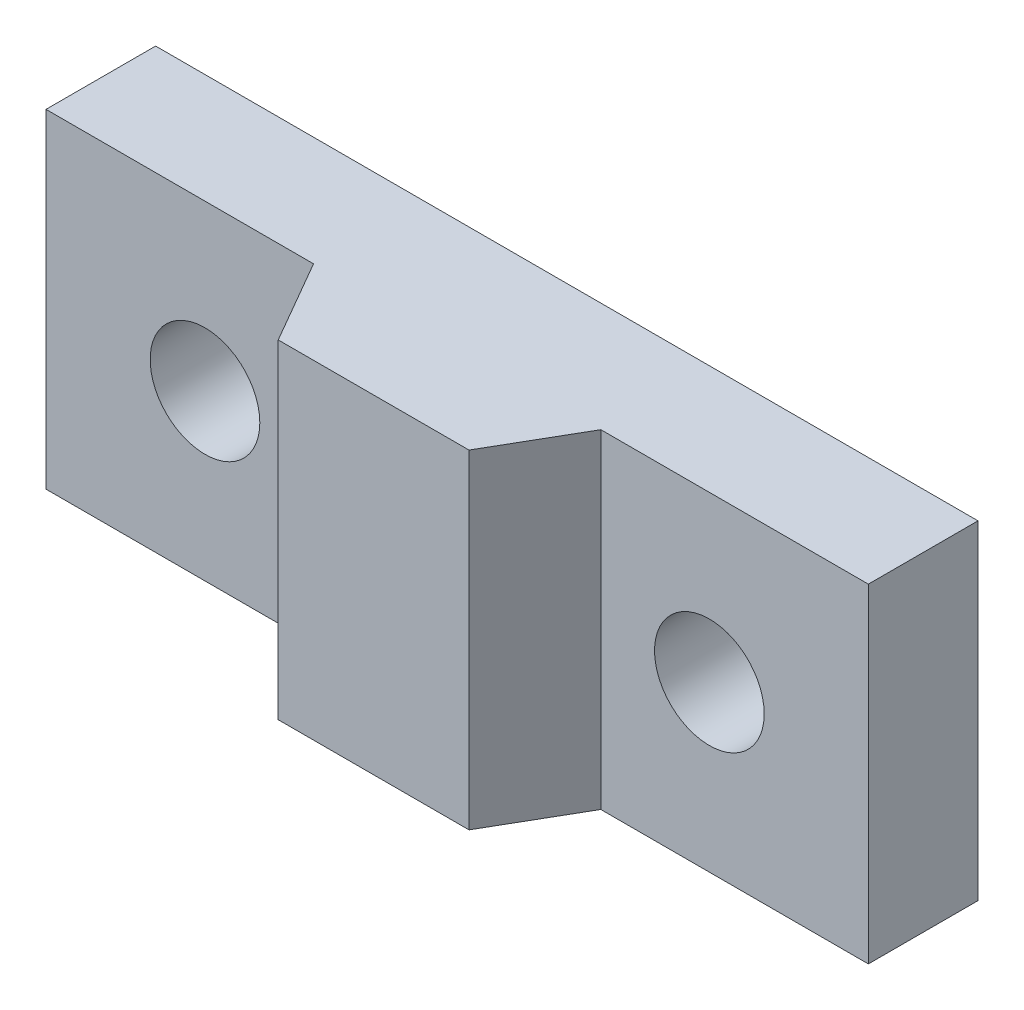
ISO-10303-21;
HEADER;
FILE_DESCRIPTION(('STEP AP214'),'2;1');
FILE_NAME('part.step','',(''),(''),'','','');
FILE_SCHEMA(('AUTOMOTIVE_DESIGN { 1 0 10303 214 1 1 1 1 }'));
ENDSEC;
DATA;
#1=APPLICATION_CONTEXT('core data for automotive mechanical design processes');
#2=APPLICATION_PROTOCOL_DEFINITION('international standard','automotive_design',2000,#1);
#3=PRODUCT_CONTEXT('',#1,'mechanical');
#4=PRODUCT('Part','Part','',(#3));
#5=PRODUCT_RELATED_PRODUCT_CATEGORY('part','',(#4));
#6=PRODUCT_DEFINITION_FORMATION('','',#4);
#7=PRODUCT_DEFINITION_CONTEXT('part definition',#1,'design');
#8=PRODUCT_DEFINITION('design','',#6,#7);
#9=PRODUCT_DEFINITION_SHAPE('','',#8);
#10=(LENGTH_UNIT() NAMED_UNIT(*) SI_UNIT(.MILLI.,.METRE.));
#11=(NAMED_UNIT(*) PLANE_ANGLE_UNIT() SI_UNIT($,.RADIAN.));
#12=(NAMED_UNIT(*) SI_UNIT($,.STERADIAN.) SOLID_ANGLE_UNIT());
#13=UNCERTAINTY_MEASURE_WITH_UNIT(LENGTH_MEASURE(1.E-05),#10,'distance_accuracy_value','');
#14=(GEOMETRIC_REPRESENTATION_CONTEXT(3) GLOBAL_UNCERTAINTY_ASSIGNED_CONTEXT((#13)) GLOBAL_UNIT_ASSIGNED_CONTEXT((#10,
#11,#12)) REPRESENTATION_CONTEXT('',''));
#15=CARTESIAN_POINT('',(0.,0.,0.));
#16=DIRECTION('',(0.,0.,1.));
#17=DIRECTION('',(1.,0.,0.));
#18=AXIS2_PLACEMENT_3D('',#15,#16,#17);
#19=CARTESIAN_POINT('',(3.04547613140312,7.62,1.75830646427617));
#20=DIRECTION('',(-0.866025403784438,0.,-0.5));
#21=DIRECTION('',(-0.5,0.,0.866025403784439));
#22=AXIS2_PLACEMENT_3D('',#19,#20,#21);
#23=PLANE('',#22);
#24=DIRECTION('',(0.5,0.,-0.866025403784439));
#25=VECTOR('',#24,1.);
#26=CARTESIAN_POINT('',(3.04547613140312,0.,1.75830646427617));
#27=LINE('',#26,#25);
#28=CARTESIAN_POINT('',(2.2098,0.,3.20573998253898));
#29=VERTEX_POINT('',#28);
#30=CARTESIAN_POINT('',(3.32740000000001,0.,1.27));
#31=VERTEX_POINT('',#30);
#32=EDGE_CURVE('E135',#29,#31,#27,.T.);
#33=ORIENTED_EDGE('',*,*,#32,.T.);
#34=DIRECTION('',(0.,-1.,0.));
#35=VECTOR('',#34,1.);
#36=CARTESIAN_POINT('',(3.32740000000001,7.62,1.27));
#37=LINE('',#36,#35);
#38=CARTESIAN_POINT('',(3.32740000000001,7.62,1.27));
#39=VERTEX_POINT('',#38);
#40=EDGE_CURVE('E11',#39,#31,#37,.T.);
#41=ORIENTED_EDGE('',*,*,#40,.F.);
#42=DIRECTION('',(0.5,0.,-0.866025403784439));
#43=VECTOR('',#42,1.);
#44=CARTESIAN_POINT('',(3.04547613140312,7.62,1.75830646427617));
#45=LINE('',#44,#43);
#46=CARTESIAN_POINT('',(2.2098,7.62,3.20573998253898));
#47=VERTEX_POINT('',#46);
#48=EDGE_CURVE('E153',#47,#39,#45,.T.);
#49=ORIENTED_EDGE('',*,*,#48,.F.);
#50=DIRECTION('',(0.,-1.,0.));
#51=VECTOR('',#50,1.);
#52=CARTESIAN_POINT('',(2.2098,7.62,3.20573998253898));
#53=LINE('',#52,#51);
#54=EDGE_CURVE('E131',#47,#29,#53,.T.);
#55=ORIENTED_EDGE('',*,*,#54,.T.);
#56=EDGE_LOOP('',(#33,#41,#49,#55));
#57=FACE_BOUND('',#56,.T.);
#58=ADVANCED_FACE('F39',(#57),#23,.F.);
#59=CARTESIAN_POINT('',(0.,7.62,1.27));
#60=DIRECTION('',(0.,0.,-1.));
#61=DIRECTION('',(-1.,0.,0.));
#62=AXIS2_PLACEMENT_3D('',#59,#60,#61);
#63=PLANE('',#62);
#64=CARTESIAN_POINT('',(5.842,3.81,1.27));
#65=DIRECTION('',(0.,0.,-1.));
#66=DIRECTION('',(-1.,0.,0.));
#67=AXIS2_PLACEMENT_3D('',#64,#65,#66);
#68=CIRCLE('',#67,1.27);
#69=CARTESIAN_POINT('',(7.112,3.81,1.27));
#70=VERTEX_POINT('',#69);
#71=EDGE_CURVE('E187',#70,#70,#68,.T.);
#72=ORIENTED_EDGE('',*,*,#71,.T.);
#73=EDGE_LOOP('',(#72));
#74=FACE_BOUND('',#73,.T.);
#75=DIRECTION('',(1.,0.,0.));
#76=VECTOR('',#75,1.);
#77=CARTESIAN_POINT('',(0.,0.,1.27));
#78=LINE('',#77,#76);
#79=CARTESIAN_POINT('',(9.52500000000001,0.,1.27));
#80=VERTEX_POINT('',#79);
#81=EDGE_CURVE('E138',#31,#80,#78,.T.);
#82=ORIENTED_EDGE('',*,*,#81,.T.);
#83=DIRECTION('',(0.,-1.,0.));
#84=VECTOR('',#83,1.);
#85=CARTESIAN_POINT('',(9.52500000000001,7.62,1.27));
#86=LINE('',#85,#84);
#87=CARTESIAN_POINT('',(9.52500000000001,7.62,1.27));
#88=VERTEX_POINT('',#87);
#89=EDGE_CURVE('E47',#88,#80,#86,.T.);
#90=ORIENTED_EDGE('',*,*,#89,.F.);
#91=DIRECTION('',(1.,0.,0.));
#92=VECTOR('',#91,1.);
#93=CARTESIAN_POINT('',(0.,7.62,1.27));
#94=LINE('',#93,#92);
#95=EDGE_CURVE('E98',#39,#88,#94,.T.);
#96=ORIENTED_EDGE('',*,*,#95,.F.);
#97=ORIENTED_EDGE('',*,*,#40,.T.);
#98=EDGE_LOOP('',(#82,#90,#96,#97));
#99=FACE_BOUND('',#98,.T.);
#100=ADVANCED_FACE('F219',(#74,#99),#63,.F.);
#101=CARTESIAN_POINT('',(9.52500000000001,7.62,0.));
#102=DIRECTION('',(-1.,0.,0.));
#103=DIRECTION('',(0.,0.,1.));
#104=AXIS2_PLACEMENT_3D('',#101,#102,#103);
#105=PLANE('',#104);
#106=DIRECTION('',(0.,0.,-1.));
#107=VECTOR('',#106,1.);
#108=CARTESIAN_POINT('',(9.52500000000001,0.,0.));
#109=LINE('',#108,#107);
#110=CARTESIAN_POINT('',(9.52500000000001,0.,-1.27));
#111=VERTEX_POINT('',#110);
#112=EDGE_CURVE('E141',#80,#111,#109,.T.);
#113=ORIENTED_EDGE('',*,*,#112,.T.);
#114=DIRECTION('',(0.,-1.,0.));
#115=VECTOR('',#114,1.);
#116=CARTESIAN_POINT('',(9.52500000000001,7.62,-1.27));
#117=LINE('',#116,#115);
#118=CARTESIAN_POINT('',(9.52500000000001,7.62,-1.27));
#119=VERTEX_POINT('',#118);
#120=EDGE_CURVE('E159',#119,#111,#117,.T.);
#121=ORIENTED_EDGE('',*,*,#120,.F.);
#122=DIRECTION('',(0.,0.,-1.));
#123=VECTOR('',#122,1.);
#124=CARTESIAN_POINT('',(9.52500000000001,7.62,0.));
#125=LINE('',#124,#123);
#126=EDGE_CURVE('E166',#88,#119,#125,.T.);
#127=ORIENTED_EDGE('',*,*,#126,.F.);
#128=ORIENTED_EDGE('',*,*,#89,.T.);
#129=EDGE_LOOP('',(#113,#121,#127,#128));
#130=FACE_BOUND('',#129,.T.);
#131=ADVANCED_FACE('F164',(#130),#105,.F.);
#132=CARTESIAN_POINT('',(0.,7.62,-1.27));
#133=DIRECTION('',(0.,0.,-1.));
#134=DIRECTION('',(-1.,0.,0.));
#135=AXIS2_PLACEMENT_3D('',#132,#133,#134);
#136=PLANE('',#135);
#137=CARTESIAN_POINT('',(5.842,3.81,-1.27));
#138=DIRECTION('',(0.,0.,-1.));
#139=DIRECTION('',(-1.,0.,0.));
#140=AXIS2_PLACEMENT_3D('',#137,#138,#139);
#141=CIRCLE('',#140,1.27);
#142=CARTESIAN_POINT('',(7.112,3.81,-1.27));
#143=VERTEX_POINT('',#142);
#144=EDGE_CURVE('E184',#143,#143,#141,.T.);
#145=ORIENTED_EDGE('',*,*,#144,.F.);
#146=EDGE_LOOP('',(#145));
#147=FACE_BOUND('',#146,.T.);
#148=CARTESIAN_POINT('',(-5.842,3.81,-1.27));
#149=DIRECTION('',(0.,0.,-1.));
#150=DIRECTION('',(-1.,0.,0.));
#151=AXIS2_PLACEMENT_3D('',#148,#149,#150);
#152=CIRCLE('',#151,1.27);
#153=CARTESIAN_POINT('',(-4.572,3.81,-1.27));
#154=VERTEX_POINT('',#153);
#155=EDGE_CURVE('E181',#154,#154,#152,.F.);
#156=ORIENTED_EDGE('',*,*,#155,.T.);
#157=EDGE_LOOP('',(#156));
#158=FACE_BOUND('',#157,.T.);
#159=DIRECTION('',(1.,0.,0.));
#160=VECTOR('',#159,1.);
#161=CARTESIAN_POINT('',(0.,0.,-1.27));
#162=LINE('',#161,#160);
#163=CARTESIAN_POINT('',(-9.52499999999999,0.,-1.27));
#164=VERTEX_POINT('',#163);
#165=EDGE_CURVE('E144',#164,#111,#162,.T.);
#166=ORIENTED_EDGE('',*,*,#165,.F.);
#167=DIRECTION('',(0.,-1.,0.));
#168=VECTOR('',#167,1.);
#169=CARTESIAN_POINT('',(-9.52499999999999,7.62,-1.27));
#170=LINE('',#169,#168);
#171=CARTESIAN_POINT('',(-9.52499999999999,7.62,-1.27));
#172=VERTEX_POINT('',#171);
#173=EDGE_CURVE('E157',#172,#164,#170,.T.);
#174=ORIENTED_EDGE('',*,*,#173,.F.);
#175=DIRECTION('',(1.,0.,0.));
#176=VECTOR('',#175,1.);
#177=CARTESIAN_POINT('',(0.,7.62,-1.27));
#178=LINE('',#177,#176);
#179=EDGE_CURVE('E175',#172,#119,#178,.T.);
#180=ORIENTED_EDGE('',*,*,#179,.T.);
#181=ORIENTED_EDGE('',*,*,#120,.T.);
#182=EDGE_LOOP('',(#166,#174,#180,#181));
#183=FACE_BOUND('',#182,.T.);
#184=ADVANCED_FACE('F173',(#147,#158,#183),#136,.T.);
#185=CARTESIAN_POINT('',(-9.52499999999999,7.62,0.));
#186=DIRECTION('',(-1.,0.,0.));
#187=DIRECTION('',(0.,0.,1.));
#188=AXIS2_PLACEMENT_3D('',#185,#186,#187);
#189=PLANE('',#188);
#190=DIRECTION('',(0.,0.,-1.));
#191=VECTOR('',#190,1.);
#192=CARTESIAN_POINT('',(-9.52499999999999,0.,0.));
#193=LINE('',#192,#191);
#194=CARTESIAN_POINT('',(-9.525,0.,1.27));
#195=VERTEX_POINT('',#194);
#196=EDGE_CURVE('E147',#195,#164,#193,.T.);
#197=ORIENTED_EDGE('',*,*,#196,.F.);
#198=DIRECTION('',(0.,-1.,0.));
#199=VECTOR('',#198,1.);
#200=CARTESIAN_POINT('',(-9.525,7.62,1.27));
#201=LINE('',#200,#199);
#202=CARTESIAN_POINT('',(-9.525,7.62,1.27));
#203=VERTEX_POINT('',#202);
#204=EDGE_CURVE('E126',#203,#195,#201,.T.);
#205=ORIENTED_EDGE('',*,*,#204,.F.);
#206=DIRECTION('',(0.,0.,-1.));
#207=VECTOR('',#206,1.);
#208=CARTESIAN_POINT('',(-9.52499999999999,7.62,0.));
#209=LINE('',#208,#207);
#210=EDGE_CURVE('E119',#203,#172,#209,.T.);
#211=ORIENTED_EDGE('',*,*,#210,.T.);
#212=ORIENTED_EDGE('',*,*,#173,.T.);
#213=EDGE_LOOP('',(#197,#205,#211,#212));
#214=FACE_BOUND('',#213,.T.);
#215=ADVANCED_FACE('F198',(#214),#189,.T.);
#216=CARTESIAN_POINT('',(0.,7.62,1.27));
#217=DIRECTION('',(0.,0.,-1.));
#218=DIRECTION('',(-1.,0.,0.));
#219=AXIS2_PLACEMENT_3D('',#216,#217,#218);
#220=PLANE('',#219);
#221=CARTESIAN_POINT('',(-5.842,3.81,1.27));
#222=DIRECTION('',(0.,0.,-1.));
#223=DIRECTION('',(-1.,0.,0.));
#224=AXIS2_PLACEMENT_3D('',#221,#222,#223);
#225=CIRCLE('',#224,1.27);
#226=CARTESIAN_POINT('',(-4.572,3.81,1.27));
#227=VERTEX_POINT('',#226);
#228=EDGE_CURVE('E139',#227,#227,#225,.F.);
#229=ORIENTED_EDGE('',*,*,#228,.F.);
#230=EDGE_LOOP('',(#229));
#231=FACE_BOUND('',#230,.T.);
#232=DIRECTION('',(1.,0.,0.));
#233=VECTOR('',#232,1.);
#234=CARTESIAN_POINT('',(0.,0.,1.27));
#235=LINE('',#234,#233);
#236=CARTESIAN_POINT('',(-3.32739999999999,0.,1.27));
#237=VERTEX_POINT('',#236);
#238=EDGE_CURVE('E125',#195,#237,#235,.T.);
#239=ORIENTED_EDGE('',*,*,#238,.T.);
#240=DIRECTION('',(0.,-1.,0.));
#241=VECTOR('',#240,1.);
#242=CARTESIAN_POINT('',(-3.32739999999999,7.62,1.27));
#243=LINE('',#242,#241);
#244=CARTESIAN_POINT('',(-3.32739999999999,7.62,1.27));
#245=VERTEX_POINT('',#244);
#246=EDGE_CURVE('E122',#245,#237,#243,.T.);
#247=ORIENTED_EDGE('',*,*,#246,.F.);
#248=DIRECTION('',(1.,0.,0.));
#249=VECTOR('',#248,1.);
#250=CARTESIAN_POINT('',(0.,7.62,1.27));
#251=LINE('',#250,#249);
#252=EDGE_CURVE('E112',#203,#245,#251,.T.);
#253=ORIENTED_EDGE('',*,*,#252,.F.);
#254=ORIENTED_EDGE('',*,*,#204,.T.);
#255=EDGE_LOOP('',(#239,#247,#253,#254));
#256=FACE_BOUND('',#255,.T.);
#257=ADVANCED_FACE('F123',(#231,#256),#220,.F.);
#258=CARTESIAN_POINT('',(-3.04547613140312,7.62,1.75830646427617));
#259=DIRECTION('',(0.866025403784439,0.,-0.499999999999999));
#260=DIRECTION('',(-0.499999999999999,0.,-0.866025403784439));
#261=AXIS2_PLACEMENT_3D('',#258,#259,#260);
#262=PLANE('',#261);
#263=DIRECTION('',(0.499999999999999,0.,0.866025403784439));
#264=VECTOR('',#263,1.);
#265=CARTESIAN_POINT('',(-3.04547613140312,0.,1.75830646427617));
#266=LINE('',#265,#264);
#267=CARTESIAN_POINT('',(-2.2098,0.,3.20573998253898));
#268=VERTEX_POINT('',#267);
#269=EDGE_CURVE('E84',#237,#268,#266,.T.);
#270=ORIENTED_EDGE('',*,*,#269,.T.);
#271=DIRECTION('',(0.,-1.,0.));
#272=VECTOR('',#271,1.);
#273=CARTESIAN_POINT('',(-2.2098,7.62,3.20573998253898));
#274=LINE('',#273,#272);
#275=CARTESIAN_POINT('',(-2.2098,7.62,3.20573998253898));
#276=VERTEX_POINT('',#275);
#277=EDGE_CURVE('E127',#276,#268,#274,.T.);
#278=ORIENTED_EDGE('',*,*,#277,.F.);
#279=DIRECTION('',(0.499999999999999,0.,0.866025403784439));
#280=VECTOR('',#279,1.);
#281=CARTESIAN_POINT('',(-3.04547613140312,7.62,1.75830646427617));
#282=LINE('',#281,#280);
#283=EDGE_CURVE('E116',#245,#276,#282,.T.);
#284=ORIENTED_EDGE('',*,*,#283,.F.);
#285=ORIENTED_EDGE('',*,*,#246,.T.);
#286=EDGE_LOOP('',(#270,#278,#284,#285));
#287=FACE_BOUND('',#286,.T.);
#288=ADVANCED_FACE('F129',(#287),#262,.F.);
#289=CARTESIAN_POINT('',(0.,7.62,3.20573998253898));
#290=DIRECTION('',(0.,0.,-1.));
#291=DIRECTION('',(-1.,0.,0.));
#292=AXIS2_PLACEMENT_3D('',#289,#290,#291);
#293=PLANE('',#292);
#294=DIRECTION('',(1.,0.,0.));
#295=VECTOR('',#294,1.);
#296=CARTESIAN_POINT('',(0.,0.,3.20573998253898));
#297=LINE('',#296,#295);
#298=EDGE_CURVE('E90',#268,#29,#297,.T.);
#299=ORIENTED_EDGE('',*,*,#298,.T.);
#300=ORIENTED_EDGE('',*,*,#54,.F.);
#301=DIRECTION('',(1.,0.,0.));
#302=VECTOR('',#301,1.);
#303=CARTESIAN_POINT('',(0.,7.62,3.20573998253898));
#304=LINE('',#303,#302);
#305=EDGE_CURVE('E55',#276,#47,#304,.T.);
#306=ORIENTED_EDGE('',*,*,#305,.F.);
#307=ORIENTED_EDGE('',*,*,#277,.T.);
#308=EDGE_LOOP('',(#299,#300,#306,#307));
#309=FACE_BOUND('',#308,.T.);
#310=ADVANCED_FACE('F214',(#309),#293,.F.);
#311=CARTESIAN_POINT('',(0.,7.62,0.));
#312=DIRECTION('',(0.,1.,0.));
#313=DIRECTION('',(0.,0.,1.));
#314=AXIS2_PLACEMENT_3D('',#311,#312,#313);
#315=PLANE('',#314);
#316=ORIENTED_EDGE('',*,*,#48,.T.);
#317=ORIENTED_EDGE('',*,*,#95,.T.);
#318=ORIENTED_EDGE('',*,*,#126,.T.);
#319=ORIENTED_EDGE('',*,*,#179,.F.);
#320=ORIENTED_EDGE('',*,*,#210,.F.);
#321=ORIENTED_EDGE('',*,*,#252,.T.);
#322=ORIENTED_EDGE('',*,*,#283,.T.);
#323=ORIENTED_EDGE('',*,*,#305,.T.);
#324=EDGE_LOOP('',(#316,#317,#318,#319,#320,#321,#322,#323));
#325=FACE_BOUND('',#324,.T.);
#326=ADVANCED_FACE('F114',(#325),#315,.T.);
#327=CARTESIAN_POINT('',(0.,0.,0.));
#328=DIRECTION('',(0.,1.,0.));
#329=DIRECTION('',(0.,0.,1.));
#330=AXIS2_PLACEMENT_3D('',#327,#328,#329);
#331=PLANE('',#330);
#332=ORIENTED_EDGE('',*,*,#32,.F.);
#333=ORIENTED_EDGE('',*,*,#298,.F.);
#334=ORIENTED_EDGE('',*,*,#269,.F.);
#335=ORIENTED_EDGE('',*,*,#238,.F.);
#336=ORIENTED_EDGE('',*,*,#196,.T.);
#337=ORIENTED_EDGE('',*,*,#165,.T.);
#338=ORIENTED_EDGE('',*,*,#112,.F.);
#339=ORIENTED_EDGE('',*,*,#81,.F.);
#340=EDGE_LOOP('',(#332,#333,#334,#335,#336,#337,#338,#339));
#341=FACE_BOUND('',#340,.T.);
#342=ADVANCED_FACE('F169',(#341),#331,.F.);
#343=CARTESIAN_POINT('',(-5.842,3.81,-1.271));
#344=DIRECTION('',(0.,0.,1.));
#345=DIRECTION('',(1.,0.,0.));
#346=AXIS2_PLACEMENT_3D('',#343,#344,#345);
#347=CYLINDRICAL_SURFACE('',#346,1.27);
#348=CARTESIAN_POINT('',(-4.572,3.81,-1.27));
#349=CARTESIAN_POINT('',(-4.572,3.81,-1.24354166666667));
#350=CARTESIAN_POINT('',(-4.572,3.81,-1.21708333333333));
#351=CARTESIAN_POINT('',(-4.572,3.81,-1.16416666666667));
#352=CARTESIAN_POINT('',(-4.572,3.81,-1.13770833333333));
#353=CARTESIAN_POINT('',(-4.572,3.81,-1.08479166666667));
#354=CARTESIAN_POINT('',(-4.572,3.81,-1.05833333333333));
#355=CARTESIAN_POINT('',(-4.572,3.81,-1.00541666666667));
#356=CARTESIAN_POINT('',(-4.572,3.81,-0.978958333333333));
#357=CARTESIAN_POINT('',(-4.572,3.81,-0.926041666666666));
#358=CARTESIAN_POINT('',(-4.572,3.81,-0.899583333333333));
#359=CARTESIAN_POINT('',(-4.572,3.81,-0.846666666666666));
#360=CARTESIAN_POINT('',(-4.572,3.81,-0.820208333333333));
#361=CARTESIAN_POINT('',(-4.572,3.81,-0.767291666666666));
#362=CARTESIAN_POINT('',(-4.572,3.81,-0.740833333333333));
#363=CARTESIAN_POINT('',(-4.572,3.81,-0.687916666666666));
#364=CARTESIAN_POINT('',(-4.572,3.81,-0.661458333333333));
#365=CARTESIAN_POINT('',(-4.572,3.81,-0.608541666666666));
#366=CARTESIAN_POINT('',(-4.572,3.81,-0.582083333333333));
#367=CARTESIAN_POINT('',(-4.572,3.81,-0.529166666666666));
#368=CARTESIAN_POINT('',(-4.572,3.81,-0.502708333333333));
#369=CARTESIAN_POINT('',(-4.572,3.81,-0.449791666666666));
#370=CARTESIAN_POINT('',(-4.572,3.81,-0.423333333333333));
#371=CARTESIAN_POINT('',(-4.572,3.81,-0.370416666666666));
#372=CARTESIAN_POINT('',(-4.572,3.81,-0.343958333333333));
#373=CARTESIAN_POINT('',(-4.572,3.81,-0.291041666666666));
#374=CARTESIAN_POINT('',(-4.572,3.81,-0.264583333333333));
#375=CARTESIAN_POINT('',(-4.572,3.81,-0.211666666666666));
#376=CARTESIAN_POINT('',(-4.572,3.81,-0.185208333333333));
#377=CARTESIAN_POINT('',(-4.572,3.81,-0.132291666666666));
#378=CARTESIAN_POINT('',(-4.572,3.81,-0.105833333333333));
#379=CARTESIAN_POINT('',(-4.572,3.81,-0.0529166666666662));
#380=CARTESIAN_POINT('',(-4.572,3.81,-0.0264583333333329));
#381=CARTESIAN_POINT('',(-4.572,3.81,0.0264583333333338));
#382=CARTESIAN_POINT('',(-4.572,3.81,0.0529166666666671));
#383=CARTESIAN_POINT('',(-4.572,3.81,0.105833333333334));
#384=CARTESIAN_POINT('',(-4.572,3.81,0.132291666666667));
#385=CARTESIAN_POINT('',(-4.572,3.81,0.185208333333334));
#386=CARTESIAN_POINT('',(-4.572,3.81,0.211666666666667));
#387=CARTESIAN_POINT('',(-4.572,3.81,0.264583333333334));
#388=CARTESIAN_POINT('',(-4.572,3.81,0.291041666666667));
#389=CARTESIAN_POINT('',(-4.572,3.81,0.343958333333334));
#390=CARTESIAN_POINT('',(-4.572,3.81,0.370416666666667));
#391=CARTESIAN_POINT('',(-4.572,3.81,0.423333333333334));
#392=CARTESIAN_POINT('',(-4.572,3.81,0.449791666666667));
#393=CARTESIAN_POINT('',(-4.572,3.81,0.502708333333334));
#394=CARTESIAN_POINT('',(-4.572,3.81,0.529166666666667));
#395=CARTESIAN_POINT('',(-4.572,3.81,0.582083333333334));
#396=CARTESIAN_POINT('',(-4.572,3.81,0.608541666666667));
#397=CARTESIAN_POINT('',(-4.572,3.81,0.661458333333334));
#398=CARTESIAN_POINT('',(-4.572,3.81,0.687916666666667));
#399=CARTESIAN_POINT('',(-4.572,3.81,0.740833333333334));
#400=CARTESIAN_POINT('',(-4.572,3.81,0.767291666666667));
#401=CARTESIAN_POINT('',(-4.572,3.81,0.820208333333334));
#402=CARTESIAN_POINT('',(-4.572,3.81,0.846666666666667));
#403=CARTESIAN_POINT('',(-4.572,3.81,0.899583333333334));
#404=CARTESIAN_POINT('',(-4.572,3.81,0.926041666666667));
#405=CARTESIAN_POINT('',(-4.572,3.81,0.978958333333334));
#406=CARTESIAN_POINT('',(-4.572,3.81,1.00541666666667));
#407=CARTESIAN_POINT('',(-4.572,3.81,1.05833333333333));
#408=CARTESIAN_POINT('',(-4.572,3.81,1.08479166666667));
#409=CARTESIAN_POINT('',(-4.572,3.81,1.13770833333333));
#410=CARTESIAN_POINT('',(-4.572,3.81,1.16416666666667));
#411=CARTESIAN_POINT('',(-4.572,3.81,1.21708333333333));
#412=CARTESIAN_POINT('',(-4.572,3.81,1.24354166666667));
#413=CARTESIAN_POINT('',(-4.572,3.81,1.27));
#414=B_SPLINE_CURVE_WITH_KNOTS('',3,(#348,#349,#350,#351,#352,#353,#354,#355,#356,#357,#358,
#359,#360,#361,#362,#363,#364,#365,#366,#367,#368,#369,#370,#371,#372,#373,#374,#375,#376,#377,
#378,#379,#380,#381,#382,#383,#384,#385,#386,#387,#388,#389,#390,#391,#392,#393,#394,#395,#396,
#397,#398,#399,#400,#401,#402,#403,#404,#405,#406,#407,#408,#409,#410,#411,#412,#413),
.UNSPECIFIED.,.F.,.F.,(4,2,2,2,2,2,2,2,2,2,2,2,2,2,2,2,2,2,2,2,2,2,2,2,2,2,2,2,2,2,2,2,4),(0.,
0.0793749999999998,0.15875,0.238125,0.3175,0.396875,0.47625,0.555625,0.635,0.714375,0.79375,
0.873125,0.9525,1.031875,1.11125,1.190625,1.27,1.349375,1.42875,1.508125,1.5875,1.666875,
1.74625,1.825625,1.905,1.984375,2.06375,2.143125,2.2225,2.301875,2.38125,2.460625,2.54),.UNSPECIFIED.);
#415=EDGE_CURVE('BSEAM202',#154,#227,#414,.T.);
#416=ORIENTED_EDGE('',*,*,#155,.F.);
#417=ORIENTED_EDGE('',*,*,#228,.T.);
#418=ORIENTED_EDGE('',*,*,#415,.T.);
#419=ORIENTED_EDGE('',*,*,#415,.F.);
#420=EDGE_LOOP('',(#416,#418,#417,#419));
#421=FACE_BOUND('',#420,.T.);
#422=ADVANCED_FACE('F202',(#421),#347,.F.);
#423=CARTESIAN_POINT('',(5.842,3.81,-1.271));
#424=DIRECTION('',(0.,0.,1.));
#425=DIRECTION('',(1.,0.,0.));
#426=AXIS2_PLACEMENT_3D('',#423,#424,#425);
#427=CYLINDRICAL_SURFACE('',#426,1.27);
#428=CARTESIAN_POINT('',(7.112,3.81,-1.27));
#429=CARTESIAN_POINT('',(7.112,3.81,-1.24354166666667));
#430=CARTESIAN_POINT('',(7.112,3.81,-1.21708333333333));
#431=CARTESIAN_POINT('',(7.112,3.81,-1.16416666666667));
#432=CARTESIAN_POINT('',(7.112,3.81,-1.13770833333333));
#433=CARTESIAN_POINT('',(7.112,3.81,-1.08479166666667));
#434=CARTESIAN_POINT('',(7.112,3.81,-1.05833333333333));
#435=CARTESIAN_POINT('',(7.112,3.81,-1.00541666666667));
#436=CARTESIAN_POINT('',(7.112,3.81,-0.978958333333333));
#437=CARTESIAN_POINT('',(7.112,3.81,-0.926041666666666));
#438=CARTESIAN_POINT('',(7.112,3.81,-0.899583333333333));
#439=CARTESIAN_POINT('',(7.112,3.81,-0.846666666666666));
#440=CARTESIAN_POINT('',(7.112,3.81,-0.820208333333333));
#441=CARTESIAN_POINT('',(7.112,3.81,-0.767291666666666));
#442=CARTESIAN_POINT('',(7.112,3.81,-0.740833333333333));
#443=CARTESIAN_POINT('',(7.112,3.81,-0.687916666666666));
#444=CARTESIAN_POINT('',(7.112,3.81,-0.661458333333333));
#445=CARTESIAN_POINT('',(7.112,3.81,-0.608541666666666));
#446=CARTESIAN_POINT('',(7.112,3.81,-0.582083333333333));
#447=CARTESIAN_POINT('',(7.112,3.81,-0.529166666666666));
#448=CARTESIAN_POINT('',(7.112,3.81,-0.502708333333333));
#449=CARTESIAN_POINT('',(7.112,3.81,-0.449791666666666));
#450=CARTESIAN_POINT('',(7.112,3.81,-0.423333333333333));
#451=CARTESIAN_POINT('',(7.112,3.81,-0.370416666666666));
#452=CARTESIAN_POINT('',(7.112,3.81,-0.343958333333333));
#453=CARTESIAN_POINT('',(7.112,3.81,-0.291041666666666));
#454=CARTESIAN_POINT('',(7.112,3.81,-0.264583333333333));
#455=CARTESIAN_POINT('',(7.112,3.81,-0.211666666666666));
#456=CARTESIAN_POINT('',(7.112,3.81,-0.185208333333333));
#457=CARTESIAN_POINT('',(7.112,3.81,-0.132291666666666));
#458=CARTESIAN_POINT('',(7.112,3.81,-0.105833333333333));
#459=CARTESIAN_POINT('',(7.112,3.81,-0.0529166666666662));
#460=CARTESIAN_POINT('',(7.112,3.81,-0.0264583333333329));
#461=CARTESIAN_POINT('',(7.112,3.81,0.0264583333333338));
#462=CARTESIAN_POINT('',(7.112,3.81,0.0529166666666671));
#463=CARTESIAN_POINT('',(7.112,3.81,0.105833333333334));
#464=CARTESIAN_POINT('',(7.112,3.81,0.132291666666667));
#465=CARTESIAN_POINT('',(7.112,3.81,0.185208333333334));
#466=CARTESIAN_POINT('',(7.112,3.81,0.211666666666667));
#467=CARTESIAN_POINT('',(7.112,3.81,0.264583333333334));
#468=CARTESIAN_POINT('',(7.112,3.81,0.291041666666667));
#469=CARTESIAN_POINT('',(7.112,3.81,0.343958333333334));
#470=CARTESIAN_POINT('',(7.112,3.81,0.370416666666667));
#471=CARTESIAN_POINT('',(7.112,3.81,0.423333333333334));
#472=CARTESIAN_POINT('',(7.112,3.81,0.449791666666667));
#473=CARTESIAN_POINT('',(7.112,3.81,0.502708333333334));
#474=CARTESIAN_POINT('',(7.112,3.81,0.529166666666667));
#475=CARTESIAN_POINT('',(7.112,3.81,0.582083333333334));
#476=CARTESIAN_POINT('',(7.112,3.81,0.608541666666667));
#477=CARTESIAN_POINT('',(7.112,3.81,0.661458333333334));
#478=CARTESIAN_POINT('',(7.112,3.81,0.687916666666667));
#479=CARTESIAN_POINT('',(7.112,3.81,0.740833333333334));
#480=CARTESIAN_POINT('',(7.112,3.81,0.767291666666667));
#481=CARTESIAN_POINT('',(7.112,3.81,0.820208333333334));
#482=CARTESIAN_POINT('',(7.112,3.81,0.846666666666667));
#483=CARTESIAN_POINT('',(7.112,3.81,0.899583333333334));
#484=CARTESIAN_POINT('',(7.112,3.81,0.926041666666667));
#485=CARTESIAN_POINT('',(7.112,3.81,0.978958333333334));
#486=CARTESIAN_POINT('',(7.112,3.81,1.00541666666667));
#487=CARTESIAN_POINT('',(7.112,3.81,1.05833333333333));
#488=CARTESIAN_POINT('',(7.112,3.81,1.08479166666667));
#489=CARTESIAN_POINT('',(7.112,3.81,1.13770833333333));
#490=CARTESIAN_POINT('',(7.112,3.81,1.16416666666667));
#491=CARTESIAN_POINT('',(7.112,3.81,1.21708333333333));
#492=CARTESIAN_POINT('',(7.112,3.81,1.24354166666667));
#493=CARTESIAN_POINT('',(7.112,3.81,1.27));
#494=B_SPLINE_CURVE_WITH_KNOTS('',3,(#428,#429,#430,#431,#432,#433,#434,#435,#436,#437,#438,
#439,#440,#441,#442,#443,#444,#445,#446,#447,#448,#449,#450,#451,#452,#453,#454,#455,#456,#457,
#458,#459,#460,#461,#462,#463,#464,#465,#466,#467,#468,#469,#470,#471,#472,#473,#474,#475,#476,
#477,#478,#479,#480,#481,#482,#483,#484,#485,#486,#487,#488,#489,#490,#491,#492,#493),
.UNSPECIFIED.,.F.,.F.,(4,2,2,2,2,2,2,2,2,2,2,2,2,2,2,2,2,2,2,2,2,2,2,2,2,2,2,2,2,2,2,2,4),(0.,
0.0793749999999998,0.15875,0.238125,0.3175,0.396875,0.47625,0.555625,0.635,0.714375,0.79375,
0.873125,0.9525,1.031875,1.11125,1.190625,1.27,1.349375,1.42875,1.508125,1.5875,1.666875,
1.74625,1.825625,1.905,1.984375,2.06375,2.143125,2.2225,2.301875,2.38125,2.460625,2.54),.UNSPECIFIED.);
#495=EDGE_CURVE('BSEAM193',#143,#70,#494,.T.);
#496=ORIENTED_EDGE('',*,*,#144,.T.);
#497=ORIENTED_EDGE('',*,*,#71,.F.);
#498=ORIENTED_EDGE('',*,*,#495,.T.);
#499=ORIENTED_EDGE('',*,*,#495,.F.);
#500=EDGE_LOOP('',(#496,#498,#497,#499));
#501=FACE_BOUND('',#500,.T.);
#502=ADVANCED_FACE('F193',(#501),#427,.F.);
#503=CLOSED_SHELL('',(#58,#100,#131,#184,#215,#257,#288,#310,#326,#342,#422,#502));
#504=MANIFOLD_SOLID_BREP('B2',#503);
#505=ADVANCED_BREP_SHAPE_REPRESENTATION('',(#18,#504),#14);
#506=SHAPE_DEFINITION_REPRESENTATION(#9,#505);
ENDSEC;
END-ISO-10303-21;
